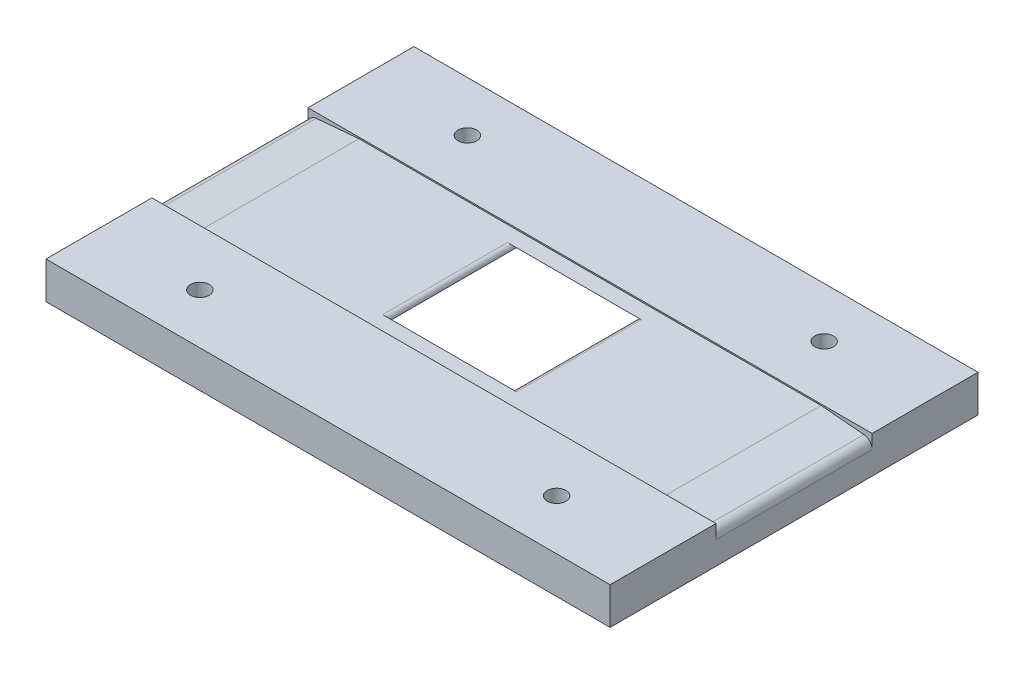
ISO-10303-21;
HEADER;
FILE_DESCRIPTION(('STEP AP214'),'2;1');
FILE_NAME('part.step','',(''),(''),'','','');
FILE_SCHEMA(('AUTOMOTIVE_DESIGN { 1 0 10303 214 1 1 1 1 }'));
ENDSEC;
DATA;
#1=APPLICATION_CONTEXT('core data for automotive mechanical design processes');
#2=APPLICATION_PROTOCOL_DEFINITION('international standard','automotive_design',2000,#1);
#3=PRODUCT_CONTEXT('',#1,'mechanical');
#4=PRODUCT('Part','Part','',(#3));
#5=PRODUCT_RELATED_PRODUCT_CATEGORY('part','',(#4));
#6=PRODUCT_DEFINITION_FORMATION('','',#4);
#7=PRODUCT_DEFINITION_CONTEXT('part definition',#1,'design');
#8=PRODUCT_DEFINITION('design','',#6,#7);
#9=PRODUCT_DEFINITION_SHAPE('','',#8);
#10=(LENGTH_UNIT() NAMED_UNIT(*) SI_UNIT(.MILLI.,.METRE.));
#11=(NAMED_UNIT(*) PLANE_ANGLE_UNIT() SI_UNIT($,.RADIAN.));
#12=(NAMED_UNIT(*) SI_UNIT($,.STERADIAN.) SOLID_ANGLE_UNIT());
#13=UNCERTAINTY_MEASURE_WITH_UNIT(LENGTH_MEASURE(1.E-05),#10,'distance_accuracy_value','');
#14=(GEOMETRIC_REPRESENTATION_CONTEXT(3) GLOBAL_UNCERTAINTY_ASSIGNED_CONTEXT((#13)) GLOBAL_UNIT_ASSIGNED_CONTEXT((#10,
#11,#12)) REPRESENTATION_CONTEXT('',''));
#15=CARTESIAN_POINT('',(0.,0.,0.));
#16=DIRECTION('',(0.,0.,1.));
#17=DIRECTION('',(1.,0.,0.));
#18=AXIS2_PLACEMENT_3D('',#15,#16,#17);
#19=CARTESIAN_POINT('',(0.,8.,0.));
#20=DIRECTION('',(0.,1.,0.));
#21=DIRECTION('',(0.,0.,1.));
#22=AXIS2_PLACEMENT_3D('',#19,#20,#21);
#23=PLANE('',#22);
#24=DIRECTION('',(-1.,0.,0.));
#25=VECTOR('',#24,1.);
#26=CARTESIAN_POINT('',(14.,8.,-14.));
#27=LINE('',#26,#25);
#28=CARTESIAN_POINT('',(15.,8.,-14.));
#29=VERTEX_POINT('',#28);
#30=CARTESIAN_POINT('',(-15.,8.,-14.));
#31=VERTEX_POINT('',#30);
#32=EDGE_CURVE('E221',#29,#31,#27,.T.);
#33=ORIENTED_EDGE('',*,*,#32,.F.);
#34=DIRECTION('',(0.,0.,-1.));
#35=VECTOR('',#34,1.);
#36=CARTESIAN_POINT('',(15.,8.,0.));
#37=LINE('',#36,#35);
#38=CARTESIAN_POINT('',(15.,8.,14.));
#39=VERTEX_POINT('',#38);
#40=EDGE_CURVE('E276',#29,#39,#37,.F.);
#41=ORIENTED_EDGE('',*,*,#40,.T.);
#42=DIRECTION('',(1.,0.,0.));
#43=VECTOR('',#42,1.);
#44=CARTESIAN_POINT('',(-14.,8.,14.));
#45=LINE('',#44,#43);
#46=CARTESIAN_POINT('',(-15.,8.,14.));
#47=VERTEX_POINT('',#46);
#48=EDGE_CURVE('E218',#47,#39,#45,.T.);
#49=ORIENTED_EDGE('',*,*,#48,.F.);
#50=DIRECTION('',(0.,0.,1.));
#51=VECTOR('',#50,1.);
#52=CARTESIAN_POINT('',(-15.,8.,0.));
#53=LINE('',#52,#51);
#54=EDGE_CURVE('E273',#47,#31,#53,.F.);
#55=ORIENTED_EDGE('',*,*,#54,.T.);
#56=EDGE_LOOP('',(#33,#41,#49,#55));
#57=FACE_BOUND('',#56,.T.);
#58=DIRECTION('',(-1.,0.,0.));
#59=VECTOR('',#58,1.);
#60=CARTESIAN_POINT('',(-63.25,8.,17.5));
#61=LINE('',#60,#59);
#62=CARTESIAN_POINT('',(51.8199476972382,8.,17.5));
#63=VERTEX_POINT('',#62);
#64=CARTESIAN_POINT('',(-51.8199476972382,8.,17.5));
#65=VERTEX_POINT('',#64);
#66=EDGE_CURVE('E186',#63,#65,#61,.T.);
#67=ORIENTED_EDGE('',*,*,#66,.F.);
#68=DIRECTION('',(0.,0.,-1.));
#69=VECTOR('',#68,1.);
#70=CARTESIAN_POINT('',(51.8199476972382,8.,-17.5));
#71=LINE('',#70,#69);
#72=CARTESIAN_POINT('',(51.8199476972382,8.,-17.5));
#73=VERTEX_POINT('',#72);
#74=EDGE_CURVE('E240',#63,#73,#71,.T.);
#75=ORIENTED_EDGE('',*,*,#74,.T.);
#76=DIRECTION('',(1.,0.,0.));
#77=VECTOR('',#76,1.);
#78=CARTESIAN_POINT('',(-63.25,8.,-17.5));
#79=LINE('',#78,#77);
#80=CARTESIAN_POINT('',(-51.8199476972382,8.,-17.5));
#81=VERTEX_POINT('',#80);
#82=EDGE_CURVE('E200',#81,#73,#79,.T.);
#83=ORIENTED_EDGE('',*,*,#82,.F.);
#84=DIRECTION('',(0.,0.,1.));
#85=VECTOR('',#84,1.);
#86=CARTESIAN_POINT('',(-51.8199476972382,8.,17.5));
#87=LINE('',#86,#85);
#88=EDGE_CURVE('E237',#81,#65,#87,.T.);
#89=ORIENTED_EDGE('',*,*,#88,.T.);
#90=EDGE_LOOP('',(#67,#75,#83,#89));
#91=FACE_BOUND('',#90,.T.);
#92=ADVANCED_FACE('F35',(#57,#91),#23,.T.);
#93=CARTESIAN_POINT('',(0.,0.,0.));
#94=DIRECTION('',(0.,1.,0.));
#95=DIRECTION('',(0.,0.,1.));
#96=AXIS2_PLACEMENT_3D('',#93,#94,#95);
#97=PLANE('',#96);
#98=CARTESIAN_POINT('',(40.,0.,-30.));
#99=DIRECTION('',(0.,1.,0.));
#100=DIRECTION('',(0.,0.,1.));
#101=AXIS2_PLACEMENT_3D('',#98,#99,#100);
#102=CIRCLE('',#101,2.1);
#103=CARTESIAN_POINT('',(40.,0.,-27.9));
#104=VERTEX_POINT('',#103);
#105=EDGE_CURVE('E599',#104,#104,#102,.T.);
#106=ORIENTED_EDGE('',*,*,#105,.T.);
#107=EDGE_LOOP('',(#106));
#108=FACE_BOUND('',#107,.T.);
#109=CARTESIAN_POINT('',(-40.,0.,30.));
#110=DIRECTION('',(0.,1.,0.));
#111=DIRECTION('',(0.,0.,1.));
#112=AXIS2_PLACEMENT_3D('',#109,#110,#111);
#113=CIRCLE('',#112,2.1);
#114=CARTESIAN_POINT('',(-40.,0.,32.1));
#115=VERTEX_POINT('',#114);
#116=EDGE_CURVE('E600',#115,#115,#113,.T.);
#117=ORIENTED_EDGE('',*,*,#116,.T.);
#118=EDGE_LOOP('',(#117));
#119=FACE_BOUND('',#118,.T.);
#120=CARTESIAN_POINT('',(40.,0.,30.));
#121=DIRECTION('',(0.,1.,0.));
#122=DIRECTION('',(0.,0.,1.));
#123=AXIS2_PLACEMENT_3D('',#120,#121,#122);
#124=CIRCLE('',#123,2.1);
#125=CARTESIAN_POINT('',(40.,0.,32.1));
#126=VERTEX_POINT('',#125);
#127=EDGE_CURVE('E587',#126,#126,#124,.T.);
#128=ORIENTED_EDGE('',*,*,#127,.T.);
#129=EDGE_LOOP('',(#128));
#130=FACE_BOUND('',#129,.T.);
#131=CARTESIAN_POINT('',(-40.,0.,-30.));
#132=DIRECTION('',(0.,1.,0.));
#133=DIRECTION('',(0.,0.,1.));
#134=AXIS2_PLACEMENT_3D('',#131,#132,#133);
#135=CIRCLE('',#134,2.1);
#136=CARTESIAN_POINT('',(-40.,0.,-27.9));
#137=VERTEX_POINT('',#136);
#138=EDGE_CURVE('E189',#137,#137,#135,.T.);
#139=ORIENTED_EDGE('',*,*,#138,.T.);
#140=EDGE_LOOP('',(#139));
#141=FACE_BOUND('',#140,.T.);
#142=DIRECTION('',(0.,0.,-1.));
#143=VECTOR('',#142,1.);
#144=CARTESIAN_POINT('',(63.25,0.,-41.25));
#145=LINE('',#144,#143);
#146=CARTESIAN_POINT('',(63.25,0.,41.25));
#147=VERTEX_POINT('',#146);
#148=CARTESIAN_POINT('',(63.25,0.,-41.25));
#149=VERTEX_POINT('',#148);
#150=EDGE_CURVE('E224',#147,#149,#145,.T.);
#151=ORIENTED_EDGE('',*,*,#150,.F.);
#152=DIRECTION('',(1.,0.,0.));
#153=VECTOR('',#152,1.);
#154=CARTESIAN_POINT('',(-63.25,0.,41.25));
#155=LINE('',#154,#153);
#156=CARTESIAN_POINT('',(-63.25,0.,41.25));
#157=VERTEX_POINT('',#156);
#158=EDGE_CURVE('E230',#157,#147,#155,.T.);
#159=ORIENTED_EDGE('',*,*,#158,.F.);
#160=DIRECTION('',(0.,0.,1.));
#161=VECTOR('',#160,1.);
#162=CARTESIAN_POINT('',(-63.25,0.,41.25));
#163=LINE('',#162,#161);
#164=CARTESIAN_POINT('',(-63.25,0.,-41.25));
#165=VERTEX_POINT('',#164);
#166=EDGE_CURVE('E168',#165,#157,#163,.T.);
#167=ORIENTED_EDGE('',*,*,#166,.F.);
#168=DIRECTION('',(-1.,0.,0.));
#169=VECTOR('',#168,1.);
#170=CARTESIAN_POINT('',(-63.25,0.,-41.25));
#171=LINE('',#170,#169);
#172=EDGE_CURVE('E227',#149,#165,#171,.T.);
#173=ORIENTED_EDGE('',*,*,#172,.F.);
#174=EDGE_LOOP('',(#151,#159,#167,#173));
#175=FACE_BOUND('',#174,.T.);
#176=DIRECTION('',(1.,0.,0.));
#177=VECTOR('',#176,1.);
#178=CARTESIAN_POINT('',(22.3422751481595,0.,23.5340287407537));
#179=LINE('',#178,#177);
#180=CARTESIAN_POINT('',(-22.3422751481595,0.,23.5340287407537));
#181=VERTEX_POINT('',#180);
#182=CARTESIAN_POINT('',(22.3422751481595,0.,23.5340287407537));
#183=VERTEX_POINT('',#182);
#184=EDGE_CURVE('E287',#181,#183,#179,.T.);
#185=ORIENTED_EDGE('',*,*,#184,.T.);
#186=DIRECTION('',(0.,0.,-1.));
#187=VECTOR('',#186,1.);
#188=CARTESIAN_POINT('',(22.3422751481595,0.,-14.));
#189=LINE('',#188,#187);
#190=CARTESIAN_POINT('',(22.3422751481595,0.,-23.5340287407537));
#191=VERTEX_POINT('',#190);
#192=EDGE_CURVE('E282',#183,#191,#189,.T.);
#193=ORIENTED_EDGE('',*,*,#192,.T.);
#194=DIRECTION('',(-1.,0.,0.));
#195=VECTOR('',#194,1.);
#196=CARTESIAN_POINT('',(-22.3422751481595,0.,-23.5340287407537));
#197=LINE('',#196,#195);
#198=CARTESIAN_POINT('',(-22.3422751481595,0.,-23.5340287407537));
#199=VERTEX_POINT('',#198);
#200=EDGE_CURVE('E284',#191,#199,#197,.T.);
#201=ORIENTED_EDGE('',*,*,#200,.T.);
#202=DIRECTION('',(0.,0.,1.));
#203=VECTOR('',#202,1.);
#204=CARTESIAN_POINT('',(-22.3422751481595,0.,14.));
#205=LINE('',#204,#203);
#206=EDGE_CURVE('E280',#199,#181,#205,.T.);
#207=ORIENTED_EDGE('',*,*,#206,.T.);
#208=EDGE_LOOP('',(#185,#193,#201,#207));
#209=FACE_BOUND('',#208,.T.);
#210=ADVANCED_FACE('F319',(#108,#119,#130,#141,#175,#209),#97,.F.);
#211=CARTESIAN_POINT('',(63.25,8.,-41.25));
#212=DIRECTION('',(-1.,0.,0.));
#213=DIRECTION('',(0.,0.,1.));
#214=AXIS2_PLACEMENT_3D('',#211,#212,#213);
#215=PLANE('',#214);
#216=DIRECTION('',(0.,0.,1.));
#217=VECTOR('',#216,1.);
#218=CARTESIAN_POINT('',(63.25,5.16733765196515,17.5));
#219=LINE('',#218,#217);
#220=CARTESIAN_POINT('',(63.25,5.16733765196515,-17.5));
#221=VERTEX_POINT('',#220);
#222=CARTESIAN_POINT('',(63.25,5.16733765196515,17.5));
#223=VERTEX_POINT('',#222);
#224=EDGE_CURVE('E253',#221,#223,#219,.T.);
#225=ORIENTED_EDGE('',*,*,#224,.T.);
#226=DIRECTION('',(0.,-1.,0.));
#227=VECTOR('',#226,1.);
#228=CARTESIAN_POINT('',(63.25,8.3,17.5));
#229=LINE('',#228,#227);
#230=CARTESIAN_POINT('',(63.25,8.3,17.5));
#231=VERTEX_POINT('',#230);
#232=EDGE_CURVE('E198',#231,#223,#229,.T.);
#233=ORIENTED_EDGE('',*,*,#232,.F.);
#234=DIRECTION('',(0.,0.,-1.));
#235=VECTOR('',#234,1.);
#236=CARTESIAN_POINT('',(63.25,8.3,41.25));
#237=LINE('',#236,#235);
#238=CARTESIAN_POINT('',(63.25,8.3,41.25));
#239=VERTEX_POINT('',#238);
#240=EDGE_CURVE('E180',#239,#231,#237,.T.);
#241=ORIENTED_EDGE('',*,*,#240,.F.);
#242=DIRECTION('',(0.,-1.,0.));
#243=VECTOR('',#242,1.);
#244=CARTESIAN_POINT('',(63.25,8.,41.25));
#245=LINE('',#244,#243);
#246=EDGE_CURVE('E172',#239,#147,#245,.T.);
#247=ORIENTED_EDGE('',*,*,#246,.T.);
#248=ORIENTED_EDGE('',*,*,#150,.T.);
#249=DIRECTION('',(0.,-1.,0.));
#250=VECTOR('',#249,1.);
#251=CARTESIAN_POINT('',(63.25,8.,-41.25));
#252=LINE('',#251,#250);
#253=CARTESIAN_POINT('',(63.25,8.3,-41.25));
#254=VERTEX_POINT('',#253);
#255=EDGE_CURVE('E234',#254,#149,#252,.T.);
#256=ORIENTED_EDGE('',*,*,#255,.F.);
#257=DIRECTION('',(0.,0.,-1.));
#258=VECTOR('',#257,1.);
#259=CARTESIAN_POINT('',(63.25,8.3,-41.25));
#260=LINE('',#259,#258);
#261=CARTESIAN_POINT('',(63.25,8.3,-17.5));
#262=VERTEX_POINT('',#261);
#263=EDGE_CURVE('E206',#262,#254,#260,.T.);
#264=ORIENTED_EDGE('',*,*,#263,.F.);
#265=DIRECTION('',(0.,-1.,0.));
#266=VECTOR('',#265,1.);
#267=CARTESIAN_POINT('',(63.25,8.3,-17.5));
#268=LINE('',#267,#266);
#269=EDGE_CURVE('E212',#262,#221,#268,.T.);
#270=ORIENTED_EDGE('',*,*,#269,.T.);
#271=EDGE_LOOP('',(#225,#233,#241,#247,#248,#256,#264,#270));
#272=FACE_BOUND('',#271,.T.);
#273=ADVANCED_FACE('F348',(#272),#215,.F.);
#274=CARTESIAN_POINT('',(-63.25,8.,-41.25));
#275=DIRECTION('',(0.,0.,1.));
#276=DIRECTION('',(1.,0.,0.));
#277=AXIS2_PLACEMENT_3D('',#274,#275,#276);
#278=PLANE('',#277);
#279=ORIENTED_EDGE('',*,*,#172,.T.);
#280=DIRECTION('',(0.,-1.,0.));
#281=VECTOR('',#280,1.);
#282=CARTESIAN_POINT('',(-63.25,8.,-41.25));
#283=LINE('',#282,#281);
#284=CARTESIAN_POINT('',(-63.25,8.3,-41.25));
#285=VERTEX_POINT('',#284);
#286=EDGE_CURVE('E171',#285,#165,#283,.T.);
#287=ORIENTED_EDGE('',*,*,#286,.F.);
#288=DIRECTION('',(-1.,0.,0.));
#289=VECTOR('',#288,1.);
#290=CARTESIAN_POINT('',(-63.25,8.3,-41.25));
#291=LINE('',#290,#289);
#292=EDGE_CURVE('E209',#254,#285,#291,.T.);
#293=ORIENTED_EDGE('',*,*,#292,.F.);
#294=ORIENTED_EDGE('',*,*,#255,.T.);
#295=EDGE_LOOP('',(#279,#287,#293,#294));
#296=FACE_BOUND('',#295,.T.);
#297=ADVANCED_FACE('F386',(#296),#278,.F.);
#298=CARTESIAN_POINT('',(-63.25,8.,41.25));
#299=DIRECTION('',(1.,0.,0.));
#300=DIRECTION('',(0.,0.,-1.));
#301=AXIS2_PLACEMENT_3D('',#298,#299,#300);
#302=PLANE('',#301);
#303=DIRECTION('',(0.,0.,-1.));
#304=VECTOR('',#303,1.);
#305=CARTESIAN_POINT('',(-63.25,5.16733765196515,-17.5));
#306=LINE('',#305,#304);
#307=CARTESIAN_POINT('',(-63.25,5.16733765196515,17.5));
#308=VERTEX_POINT('',#307);
#309=CARTESIAN_POINT('',(-63.25,5.16733765196515,-17.5));
#310=VERTEX_POINT('',#309);
#311=EDGE_CURVE('E258',#308,#310,#306,.T.);
#312=ORIENTED_EDGE('',*,*,#311,.T.);
#313=DIRECTION('',(0.,-1.,0.));
#314=VECTOR('',#313,1.);
#315=CARTESIAN_POINT('',(-63.25,8.3,-17.5));
#316=LINE('',#315,#314);
#317=CARTESIAN_POINT('',(-63.25,8.3,-17.5));
#318=VERTEX_POINT('',#317);
#319=EDGE_CURVE('E216',#318,#310,#316,.T.);
#320=ORIENTED_EDGE('',*,*,#319,.F.);
#321=DIRECTION('',(0.,0.,1.));
#322=VECTOR('',#321,1.);
#323=CARTESIAN_POINT('',(-63.25,8.3,-17.5));
#324=LINE('',#323,#322);
#325=EDGE_CURVE('E201',#285,#318,#324,.T.);
#326=ORIENTED_EDGE('',*,*,#325,.F.);
#327=ORIENTED_EDGE('',*,*,#286,.T.);
#328=ORIENTED_EDGE('',*,*,#166,.T.);
#329=DIRECTION('',(0.,-1.,0.));
#330=VECTOR('',#329,1.);
#331=CARTESIAN_POINT('',(-63.25,8.,41.25));
#332=LINE('',#331,#330);
#333=CARTESIAN_POINT('',(-63.25,8.3,41.25));
#334=VERTEX_POINT('',#333);
#335=EDGE_CURVE('E160',#334,#157,#332,.T.);
#336=ORIENTED_EDGE('',*,*,#335,.F.);
#337=DIRECTION('',(0.,0.,1.));
#338=VECTOR('',#337,1.);
#339=CARTESIAN_POINT('',(-63.25,8.3,17.5));
#340=LINE('',#339,#338);
#341=CARTESIAN_POINT('',(-63.25,8.3,17.5));
#342=VERTEX_POINT('',#341);
#343=EDGE_CURVE('E165',#342,#334,#340,.T.);
#344=ORIENTED_EDGE('',*,*,#343,.F.);
#345=DIRECTION('',(0.,-1.,0.));
#346=VECTOR('',#345,1.);
#347=CARTESIAN_POINT('',(-63.25,8.3,17.5));
#348=LINE('',#347,#346);
#349=EDGE_CURVE('E195',#342,#308,#348,.T.);
#350=ORIENTED_EDGE('',*,*,#349,.T.);
#351=EDGE_LOOP('',(#312,#320,#326,#327,#328,#336,#344,#350));
#352=FACE_BOUND('',#351,.T.);
#353=ADVANCED_FACE('F163',(#352),#302,.F.);
#354=CARTESIAN_POINT('',(-63.25,8.,41.25));
#355=DIRECTION('',(0.,0.,-1.));
#356=DIRECTION('',(-1.,0.,0.));
#357=AXIS2_PLACEMENT_3D('',#354,#355,#356);
#358=PLANE('',#357);
#359=ORIENTED_EDGE('',*,*,#158,.T.);
#360=ORIENTED_EDGE('',*,*,#246,.F.);
#361=DIRECTION('',(1.,0.,0.));
#362=VECTOR('',#361,1.);
#363=CARTESIAN_POINT('',(-63.25,8.3,41.25));
#364=LINE('',#363,#362);
#365=EDGE_CURVE('E175',#334,#239,#364,.T.);
#366=ORIENTED_EDGE('',*,*,#365,.F.);
#367=ORIENTED_EDGE('',*,*,#335,.T.);
#368=EDGE_LOOP('',(#359,#360,#366,#367));
#369=FACE_BOUND('',#368,.T.);
#370=ADVANCED_FACE('F176',(#369),#358,.F.);
#371=CARTESIAN_POINT('',(-63.25,8.3,-17.5));
#372=DIRECTION('',(0.,0.,-1.));
#373=DIRECTION('',(-1.,0.,0.));
#374=AXIS2_PLACEMENT_3D('',#371,#372,#373);
#375=PLANE('',#374);
#376=ORIENTED_EDGE('',*,*,#319,.T.);
#377=CARTESIAN_POINT('',(-61.25,5.16733765196515,-17.5));
#378=DIRECTION('',(0.,0.,-1.));
#379=DIRECTION('',(-1.,0.,0.));
#380=AXIS2_PLACEMENT_3D('',#377,#378,#379);
#381=CIRCLE('',#380,2.);
#382=CARTESIAN_POINT('',(-61.4243114854953,7.15972704814864,-17.5));
#383=VERTEX_POINT('',#382);
#384=EDGE_CURVE('E267',#310,#383,#381,.T.);
#385=ORIENTED_EDGE('',*,*,#384,.T.);
#386=DIRECTION('',(0.996194698091746,0.0871557427476551,0.));
#387=VECTOR('',#386,1.);
#388=CARTESIAN_POINT('',(-63.1371286845165,7.00987496054206,-17.5));
#389=LINE('',#388,#387);
#390=EDGE_CURVE('E251',#383,#81,#389,.T.);
#391=ORIENTED_EDGE('',*,*,#390,.T.);
#392=ORIENTED_EDGE('',*,*,#82,.T.);
#393=DIRECTION('',(0.996194698091746,-0.0871557427476551,0.));
#394=VECTOR('',#393,1.);
#395=CARTESIAN_POINT('',(-62.4019616935057,17.993122197975,-17.5));
#396=LINE('',#395,#394);
#397=CARTESIAN_POINT('',(61.4243114854954,7.15972704814864,-17.5));
#398=VERTEX_POINT('',#397);
#399=EDGE_CURVE('E243',#73,#398,#396,.T.);
#400=ORIENTED_EDGE('',*,*,#399,.T.);
#401=CARTESIAN_POINT('',(61.25,5.16733765196515,-17.5));
#402=DIRECTION('',(0.,0.,-1.));
#403=DIRECTION('',(-1.,0.,0.));
#404=AXIS2_PLACEMENT_3D('',#401,#402,#403);
#405=CIRCLE('',#404,2.);
#406=EDGE_CURVE('E264',#398,#221,#405,.T.);
#407=ORIENTED_EDGE('',*,*,#406,.T.);
#408=ORIENTED_EDGE('',*,*,#269,.F.);
#409=DIRECTION('',(1.,0.,0.));
#410=VECTOR('',#409,1.);
#411=CARTESIAN_POINT('',(-63.25,8.3,-17.5));
#412=LINE('',#411,#410);
#413=EDGE_CURVE('E204',#318,#262,#412,.T.);
#414=ORIENTED_EDGE('',*,*,#413,.F.);
#415=EDGE_LOOP('',(#376,#385,#391,#392,#400,#407,#408,#414));
#416=FACE_BOUND('',#415,.T.);
#417=ADVANCED_FACE('F340',(#416),#375,.F.);
#418=CARTESIAN_POINT('',(0.,8.3,0.));
#419=DIRECTION('',(0.,-1.,0.));
#420=DIRECTION('',(0.,0.,-1.));
#421=AXIS2_PLACEMENT_3D('',#418,#419,#420);
#422=PLANE('',#421);
#423=CARTESIAN_POINT('',(40.,8.3,-30.));
#424=DIRECTION('',(0.,1.,0.));
#425=DIRECTION('',(0.,0.,1.));
#426=AXIS2_PLACEMENT_3D('',#423,#424,#425);
#427=CIRCLE('',#426,2.1);
#428=CARTESIAN_POINT('',(40.,8.3,-27.9));
#429=VERTEX_POINT('',#428);
#430=EDGE_CURVE('E596',#429,#429,#427,.T.);
#431=ORIENTED_EDGE('',*,*,#430,.F.);
#432=EDGE_LOOP('',(#431));
#433=FACE_BOUND('',#432,.T.);
#434=CARTESIAN_POINT('',(-40.,8.3,-30.));
#435=DIRECTION('',(0.,1.,0.));
#436=DIRECTION('',(0.,0.,1.));
#437=AXIS2_PLACEMENT_3D('',#434,#435,#436);
#438=CIRCLE('',#437,2.1);
#439=CARTESIAN_POINT('',(-40.,8.3,-27.9));
#440=VERTEX_POINT('',#439);
#441=EDGE_CURVE('E603',#440,#440,#438,.T.);
#442=ORIENTED_EDGE('',*,*,#441,.F.);
#443=EDGE_LOOP('',(#442));
#444=FACE_BOUND('',#443,.T.);
#445=ORIENTED_EDGE('',*,*,#325,.T.);
#446=ORIENTED_EDGE('',*,*,#413,.T.);
#447=ORIENTED_EDGE('',*,*,#263,.T.);
#448=ORIENTED_EDGE('',*,*,#292,.T.);
#449=EDGE_LOOP('',(#445,#446,#447,#448));
#450=FACE_BOUND('',#449,.T.);
#451=ADVANCED_FACE('F354',(#433,#444,#450),#422,.F.);
#452=CARTESIAN_POINT('',(-63.25,8.3,17.5));
#453=DIRECTION('',(0.,0.,1.));
#454=DIRECTION('',(1.,0.,0.));
#455=AXIS2_PLACEMENT_3D('',#452,#453,#454);
#456=PLANE('',#455);
#457=ORIENTED_EDGE('',*,*,#232,.T.);
#458=CARTESIAN_POINT('',(61.25,5.16733765196515,17.5));
#459=DIRECTION('',(0.,0.,1.));
#460=DIRECTION('',(1.,0.,0.));
#461=AXIS2_PLACEMENT_3D('',#458,#459,#460);
#462=CIRCLE('',#461,2.);
#463=CARTESIAN_POINT('',(61.4243114854954,7.15972704814864,17.5));
#464=VERTEX_POINT('',#463);
#465=EDGE_CURVE('E262',#223,#464,#462,.T.);
#466=ORIENTED_EDGE('',*,*,#465,.T.);
#467=DIRECTION('',(-0.996194698091746,0.0871557427476551,0.));
#468=VECTOR('',#467,1.);
#469=CARTESIAN_POINT('',(-62.4019616935057,17.993122197975,17.5));
#470=LINE('',#469,#468);
#471=EDGE_CURVE('E246',#464,#63,#470,.T.);
#472=ORIENTED_EDGE('',*,*,#471,.T.);
#473=ORIENTED_EDGE('',*,*,#66,.T.);
#474=DIRECTION('',(-0.996194698091746,-0.0871557427476551,0.));
#475=VECTOR('',#474,1.);
#476=CARTESIAN_POINT('',(-63.1371286845165,7.00987496054206,17.5));
#477=LINE('',#476,#475);
#478=CARTESIAN_POINT('',(-61.4243114854953,7.15972704814864,17.5));
#479=VERTEX_POINT('',#478);
#480=EDGE_CURVE('E248',#65,#479,#477,.T.);
#481=ORIENTED_EDGE('',*,*,#480,.T.);
#482=CARTESIAN_POINT('',(-61.25,5.16733765196515,17.5));
#483=DIRECTION('',(0.,0.,1.));
#484=DIRECTION('',(1.,0.,0.));
#485=AXIS2_PLACEMENT_3D('',#482,#483,#484);
#486=CIRCLE('',#485,2.);
#487=EDGE_CURVE('E269',#479,#308,#486,.T.);
#488=ORIENTED_EDGE('',*,*,#487,.T.);
#489=ORIENTED_EDGE('',*,*,#349,.F.);
#490=DIRECTION('',(-1.,0.,0.));
#491=VECTOR('',#490,1.);
#492=CARTESIAN_POINT('',(-63.25,8.3,17.5));
#493=LINE('',#492,#491);
#494=EDGE_CURVE('E184',#231,#342,#493,.T.);
#495=ORIENTED_EDGE('',*,*,#494,.F.);
#496=EDGE_LOOP('',(#457,#466,#472,#473,#481,#488,#489,#495));
#497=FACE_BOUND('',#496,.T.);
#498=ADVANCED_FACE('F364',(#497),#456,.F.);
#499=CARTESIAN_POINT('',(0.,8.3,0.));
#500=DIRECTION('',(0.,1.,0.));
#501=DIRECTION('',(0.,0.,1.));
#502=AXIS2_PLACEMENT_3D('',#499,#500,#501);
#503=PLANE('',#502);
#504=CARTESIAN_POINT('',(-40.,8.3,30.));
#505=DIRECTION('',(0.,1.,0.));
#506=DIRECTION('',(0.,0.,1.));
#507=AXIS2_PLACEMENT_3D('',#504,#505,#506);
#508=CIRCLE('',#507,2.1);
#509=CARTESIAN_POINT('',(-40.,8.3,32.1));
#510=VERTEX_POINT('',#509);
#511=EDGE_CURVE('E593',#510,#510,#508,.T.);
#512=ORIENTED_EDGE('',*,*,#511,.F.);
#513=EDGE_LOOP('',(#512));
#514=FACE_BOUND('',#513,.T.);
#515=CARTESIAN_POINT('',(40.,8.3,30.));
#516=DIRECTION('',(0.,1.,0.));
#517=DIRECTION('',(0.,0.,1.));
#518=AXIS2_PLACEMENT_3D('',#515,#516,#517);
#519=CIRCLE('',#518,2.1);
#520=CARTESIAN_POINT('',(40.,8.3,32.1));
#521=VERTEX_POINT('',#520);
#522=EDGE_CURVE('E590',#521,#521,#519,.T.);
#523=ORIENTED_EDGE('',*,*,#522,.F.);
#524=EDGE_LOOP('',(#523));
#525=FACE_BOUND('',#524,.T.);
#526=ORIENTED_EDGE('',*,*,#343,.T.);
#527=ORIENTED_EDGE('',*,*,#365,.T.);
#528=ORIENTED_EDGE('',*,*,#240,.T.);
#529=ORIENTED_EDGE('',*,*,#494,.T.);
#530=EDGE_LOOP('',(#526,#527,#528,#529));
#531=FACE_BOUND('',#530,.T.);
#532=ADVANCED_FACE('F182',(#514,#525,#531),#503,.T.);
#533=CARTESIAN_POINT('',(51.8199476972382,8.,0.));
#534=DIRECTION('',(0.087155742747655,0.996194698091746,0.));
#535=DIRECTION('',(0.,0.,1.));
#536=AXIS2_PLACEMENT_3D('',#533,#534,#535);
#537=PLANE('',#536);
#538=ORIENTED_EDGE('',*,*,#471,.F.);
#539=DIRECTION('',(0.,0.,1.));
#540=VECTOR('',#539,1.);
#541=CARTESIAN_POINT('',(61.4243114854953,7.15972704814864,-17.5));
#542=LINE('',#541,#540);
#543=EDGE_CURVE('E256',#464,#398,#542,.F.);
#544=ORIENTED_EDGE('',*,*,#543,.T.);
#545=ORIENTED_EDGE('',*,*,#399,.F.);
#546=ORIENTED_EDGE('',*,*,#74,.F.);
#547=EDGE_LOOP('',(#538,#544,#545,#546));
#548=FACE_BOUND('',#547,.T.);
#549=ADVANCED_FACE('F336',(#548),#537,.T.);
#550=CARTESIAN_POINT('',(-51.8199476972382,8.,0.));
#551=DIRECTION('',(-0.087155742747655,0.996194698091746,0.));
#552=DIRECTION('',(0.,0.,-1.));
#553=AXIS2_PLACEMENT_3D('',#550,#551,#552);
#554=PLANE('',#553);
#555=ORIENTED_EDGE('',*,*,#390,.F.);
#556=DIRECTION('',(0.,0.,-1.));
#557=VECTOR('',#556,1.);
#558=CARTESIAN_POINT('',(-61.4243114854953,7.15972704814864,17.5));
#559=LINE('',#558,#557);
#560=EDGE_CURVE('E260',#383,#479,#559,.F.);
#561=ORIENTED_EDGE('',*,*,#560,.T.);
#562=ORIENTED_EDGE('',*,*,#480,.F.);
#563=ORIENTED_EDGE('',*,*,#88,.F.);
#564=EDGE_LOOP('',(#555,#561,#562,#563));
#565=FACE_BOUND('',#564,.T.);
#566=ADVANCED_FACE('F363',(#565),#554,.T.);
#567=CARTESIAN_POINT('',(61.25,5.16733765196515,-41.25));
#568=DIRECTION('',(0.,0.,-1.));
#569=DIRECTION('',(-1.,0.,0.));
#570=AXIS2_PLACEMENT_3D('',#567,#568,#569);
#571=CYLINDRICAL_SURFACE('',#570,2.);
#572=ORIENTED_EDGE('',*,*,#406,.F.);
#573=ORIENTED_EDGE('',*,*,#543,.F.);
#574=ORIENTED_EDGE('',*,*,#465,.F.);
#575=ORIENTED_EDGE('',*,*,#224,.F.);
#576=EDGE_LOOP('',(#572,#573,#574,#575));
#577=FACE_BOUND('',#576,.T.);
#578=ADVANCED_FACE('F344',(#577),#571,.T.);
#579=CARTESIAN_POINT('',(-61.25,5.16733765196515,41.25));
#580=DIRECTION('',(0.,0.,1.));
#581=DIRECTION('',(1.,0.,0.));
#582=AXIS2_PLACEMENT_3D('',#579,#580,#581);
#583=CYLINDRICAL_SURFACE('',#582,2.);
#584=ORIENTED_EDGE('',*,*,#487,.F.);
#585=ORIENTED_EDGE('',*,*,#560,.F.);
#586=ORIENTED_EDGE('',*,*,#384,.F.);
#587=ORIENTED_EDGE('',*,*,#311,.F.);
#588=EDGE_LOOP('',(#584,#585,#586,#587));
#589=FACE_BOUND('',#588,.T.);
#590=ADVANCED_FACE('F359',(#589),#583,.T.);
#591=CARTESIAN_POINT('',(15.,7.,14.));
#592=DIRECTION('',(0.,0.,-1.));
#593=DIRECTION('',(-1.,0.,0.));
#594=AXIS2_PLACEMENT_3D('',#591,#592,#593);
#595=CYLINDRICAL_SURFACE('',#594,1.);
#596=DIRECTION('',(0.,0.,-1.));
#597=VECTOR('',#596,1.);
#598=CARTESIAN_POINT('',(14.,7.,14.));
#599=LINE('',#598,#597);
#600=CARTESIAN_POINT('',(14.,7.,15.1917535925942));
#601=VERTEX_POINT('',#600);
#602=CARTESIAN_POINT('',(14.,7.,-15.1917535925942));
#603=VERTEX_POINT('',#602);
#604=EDGE_CURVE('E49',#601,#603,#599,.T.);
#605=ORIENTED_EDGE('',*,*,#604,.F.);
#606=CARTESIAN_POINT('',(15.,7.,15.1917535925942));
#607=DIRECTION('',(0.,-0.766044443118977,-0.64278760968654));
#608=DIRECTION('',(0.,0.64278760968654,-0.766044443118977));
#609=AXIS2_PLACEMENT_3D('',#606,#607,#608);
#610=ELLIPSE('',#609,1.55572382686041,1.);
#611=EDGE_CURVE('E292',#601,#39,#610,.T.);
#612=ORIENTED_EDGE('',*,*,#611,.T.);
#613=ORIENTED_EDGE('',*,*,#40,.F.);
#614=CARTESIAN_POINT('',(15.,7.,-15.1917535925942));
#615=DIRECTION('',(0.,-0.766044443118977,0.64278760968654));
#616=DIRECTION('',(0.,-0.64278760968654,-0.766044443118977));
#617=AXIS2_PLACEMENT_3D('',#614,#615,#616);
#618=ELLIPSE('',#617,1.55572382686041,1.);
#619=EDGE_CURVE('E43',#29,#603,#618,.T.);
#620=ORIENTED_EDGE('',*,*,#619,.T.);
#621=EDGE_LOOP('',(#605,#612,#613,#620));
#622=FACE_BOUND('',#621,.T.);
#623=ADVANCED_FACE('F306',(#622),#595,.T.);
#624=CARTESIAN_POINT('',(-15.,7.,-14.));
#625=DIRECTION('',(0.,0.,1.));
#626=DIRECTION('',(1.,0.,0.));
#627=AXIS2_PLACEMENT_3D('',#624,#625,#626);
#628=CYLINDRICAL_SURFACE('',#627,1.);
#629=DIRECTION('',(0.,0.,1.));
#630=VECTOR('',#629,1.);
#631=CARTESIAN_POINT('',(-14.,7.,-14.));
#632=LINE('',#631,#630);
#633=CARTESIAN_POINT('',(-14.,7.,-15.1917535925942));
#634=VERTEX_POINT('',#633);
#635=CARTESIAN_POINT('',(-14.,7.,15.1917535925942));
#636=VERTEX_POINT('',#635);
#637=EDGE_CURVE('E57',#634,#636,#632,.T.);
#638=ORIENTED_EDGE('',*,*,#637,.F.);
#639=CARTESIAN_POINT('',(-15.,7.,-15.1917535925942));
#640=DIRECTION('',(0.,-0.766044443118977,0.64278760968654));
#641=DIRECTION('',(0.,0.64278760968654,0.766044443118977));
#642=AXIS2_PLACEMENT_3D('',#639,#640,#641);
#643=ELLIPSE('',#642,1.55572382686041,1.);
#644=EDGE_CURVE('E301',#634,#31,#643,.T.);
#645=ORIENTED_EDGE('',*,*,#644,.T.);
#646=ORIENTED_EDGE('',*,*,#54,.F.);
#647=CARTESIAN_POINT('',(-15.,7.,15.1917535925942));
#648=DIRECTION('',(0.,-0.766044443118977,-0.64278760968654));
#649=DIRECTION('',(0.,-0.64278760968654,0.766044443118977));
#650=AXIS2_PLACEMENT_3D('',#647,#648,#649);
#651=ELLIPSE('',#650,1.55572382686041,1.);
#652=EDGE_CURVE('E294',#47,#636,#651,.T.);
#653=ORIENTED_EDGE('',*,*,#652,.T.);
#654=EDGE_LOOP('',(#638,#645,#646,#653));
#655=FACE_BOUND('',#654,.T.);
#656=ADVANCED_FACE('F323',(#655),#628,.T.);
#657=CARTESIAN_POINT('',(40.,0.,30.));
#658=DIRECTION('',(0.,1.,0.));
#659=DIRECTION('',(0.,0.,1.));
#660=AXIS2_PLACEMENT_3D('',#657,#658,#659);
#661=CYLINDRICAL_SURFACE('',#660,2.1);
#662=ORIENTED_EDGE('',*,*,#127,.F.);
#663=EDGE_LOOP('',(#662));
#664=FACE_BOUND('',#663,.T.);
#665=ORIENTED_EDGE('',*,*,#522,.T.);
#666=EDGE_LOOP('',(#665));
#667=FACE_BOUND('',#666,.T.);
#668=ADVANCED_FACE('F404',(#664,#667),#661,.F.);
#669=CARTESIAN_POINT('',(-40.,0.,30.));
#670=DIRECTION('',(0.,1.,0.));
#671=DIRECTION('',(0.,0.,1.));
#672=AXIS2_PLACEMENT_3D('',#669,#670,#671);
#673=CYLINDRICAL_SURFACE('',#672,2.1);
#674=ORIENTED_EDGE('',*,*,#116,.F.);
#675=EDGE_LOOP('',(#674));
#676=FACE_BOUND('',#675,.T.);
#677=ORIENTED_EDGE('',*,*,#511,.T.);
#678=EDGE_LOOP('',(#677));
#679=FACE_BOUND('',#678,.T.);
#680=ADVANCED_FACE('F476',(#676,#679),#673,.F.);
#681=CARTESIAN_POINT('',(-40.,0.,-30.));
#682=DIRECTION('',(0.,1.,0.));
#683=DIRECTION('',(0.,0.,1.));
#684=AXIS2_PLACEMENT_3D('',#681,#682,#683);
#685=CYLINDRICAL_SURFACE('',#684,2.1);
#686=ORIENTED_EDGE('',*,*,#138,.F.);
#687=EDGE_LOOP('',(#686));
#688=FACE_BOUND('',#687,.T.);
#689=ORIENTED_EDGE('',*,*,#441,.T.);
#690=EDGE_LOOP('',(#689));
#691=FACE_BOUND('',#690,.T.);
#692=ADVANCED_FACE('F466',(#688,#691),#685,.F.);
#693=CARTESIAN_POINT('',(40.,0.,-30.));
#694=DIRECTION('',(0.,1.,0.));
#695=DIRECTION('',(0.,0.,1.));
#696=AXIS2_PLACEMENT_3D('',#693,#694,#695);
#697=CYLINDRICAL_SURFACE('',#696,2.1);
#698=ORIENTED_EDGE('',*,*,#105,.F.);
#699=EDGE_LOOP('',(#698));
#700=FACE_BOUND('',#699,.T.);
#701=ORIENTED_EDGE('',*,*,#430,.T.);
#702=EDGE_LOOP('',(#701));
#703=FACE_BOUND('',#702,.T.);
#704=ADVANCED_FACE('F407',(#700,#703),#697,.F.);
#705=CARTESIAN_POINT('',(22.3422751481595,0.,0.));
#706=DIRECTION('',(-0.642787609686541,-0.766044443118977,0.));
#707=DIRECTION('',(0.,0.,1.));
#708=AXIS2_PLACEMENT_3D('',#705,#706,#707);
#709=PLANE('',#708);
#710=ORIENTED_EDGE('',*,*,#192,.F.);
#711=DIRECTION('',(-0.608120402411342,0.510273605374738,-0.608120402411343));
#712=VECTOR('',#711,1.);
#713=CARTESIAN_POINT('',(14.079868906316,6.93298203016775,15.2716224989102));
#714=LINE('',#713,#712);
#715=EDGE_CURVE('E290',#183,#601,#714,.T.);
#716=ORIENTED_EDGE('',*,*,#715,.T.);
#717=ORIENTED_EDGE('',*,*,#604,.T.);
#718=DIRECTION('',(0.608120402411342,-0.510273605374738,-0.608120402411343));
#719=VECTOR('',#718,1.);
#720=CARTESIAN_POINT('',(14.079868906316,6.93298203016775,-15.2716224989102));
#721=LINE('',#720,#719);
#722=EDGE_CURVE('E11',#603,#191,#721,.T.);
#723=ORIENTED_EDGE('',*,*,#722,.T.);
#724=EDGE_LOOP('',(#710,#716,#717,#723));
#725=FACE_BOUND('',#724,.T.);
#726=ADVANCED_FACE('F310',(#725),#709,.T.);
#727=CARTESIAN_POINT('',(-22.3422751481595,0.,0.));
#728=DIRECTION('',(0.642787609686541,-0.766044443118977,0.));
#729=DIRECTION('',(0.,0.,-1.));
#730=AXIS2_PLACEMENT_3D('',#727,#728,#729);
#731=PLANE('',#730);
#732=ORIENTED_EDGE('',*,*,#206,.F.);
#733=DIRECTION('',(0.608120402411342,0.510273605374738,0.608120402411343));
#734=VECTOR('',#733,1.);
#735=CARTESIAN_POINT('',(-14.079868906316,6.93298203016775,-15.2716224989102));
#736=LINE('',#735,#734);
#737=EDGE_CURVE('E299',#199,#634,#736,.T.);
#738=ORIENTED_EDGE('',*,*,#737,.T.);
#739=ORIENTED_EDGE('',*,*,#637,.T.);
#740=DIRECTION('',(-0.608120402411342,-0.510273605374738,0.608120402411343));
#741=VECTOR('',#740,1.);
#742=CARTESIAN_POINT('',(-14.079868906316,6.93298203016775,15.2716224989102));
#743=LINE('',#742,#741);
#744=EDGE_CURVE('E296',#636,#181,#743,.T.);
#745=ORIENTED_EDGE('',*,*,#744,.T.);
#746=EDGE_LOOP('',(#732,#738,#739,#745));
#747=FACE_BOUND('',#746,.T.);
#748=ADVANCED_FACE('F321',(#747),#731,.T.);
#749=CARTESIAN_POINT('',(0.,0.,23.5340287407537));
#750=DIRECTION('',(0.,-0.766044443118977,-0.64278760968654));
#751=DIRECTION('',(-1.,0.,0.));
#752=AXIS2_PLACEMENT_3D('',#749,#750,#751);
#753=PLANE('',#752);
#754=ORIENTED_EDGE('',*,*,#652,.F.);
#755=ORIENTED_EDGE('',*,*,#48,.T.);
#756=ORIENTED_EDGE('',*,*,#611,.F.);
#757=ORIENTED_EDGE('',*,*,#715,.F.);
#758=ORIENTED_EDGE('',*,*,#184,.F.);
#759=ORIENTED_EDGE('',*,*,#744,.F.);
#760=EDGE_LOOP('',(#754,#755,#756,#757,#758,#759));
#761=FACE_BOUND('',#760,.T.);
#762=ADVANCED_FACE('F317',(#761),#753,.T.);
#763=CARTESIAN_POINT('',(0.,0.,-23.5340287407537));
#764=DIRECTION('',(0.,-0.766044443118977,0.64278760968654));
#765=DIRECTION('',(1.,0.,0.));
#766=AXIS2_PLACEMENT_3D('',#763,#764,#765);
#767=PLANE('',#766);
#768=ORIENTED_EDGE('',*,*,#619,.F.);
#769=ORIENTED_EDGE('',*,*,#32,.T.);
#770=ORIENTED_EDGE('',*,*,#644,.F.);
#771=ORIENTED_EDGE('',*,*,#737,.F.);
#772=ORIENTED_EDGE('',*,*,#200,.F.);
#773=ORIENTED_EDGE('',*,*,#722,.F.);
#774=EDGE_LOOP('',(#768,#769,#770,#771,#772,#773));
#775=FACE_BOUND('',#774,.T.);
#776=ADVANCED_FACE('F37',(#775),#767,.T.);
#777=CLOSED_SHELL('',(#92,#210,#273,#297,#353,#370,#417,#451,#498,#532,#549,#566,#578,#590,#623,
#656,#668,#680,#692,#704,#726,#748,#762,#776));
#778=MANIFOLD_SOLID_BREP('B2',#777);
#779=ADVANCED_BREP_SHAPE_REPRESENTATION('',(#18,#778),#14);
#780=SHAPE_DEFINITION_REPRESENTATION(#9,#779);
ENDSEC;
END-ISO-10303-21;
